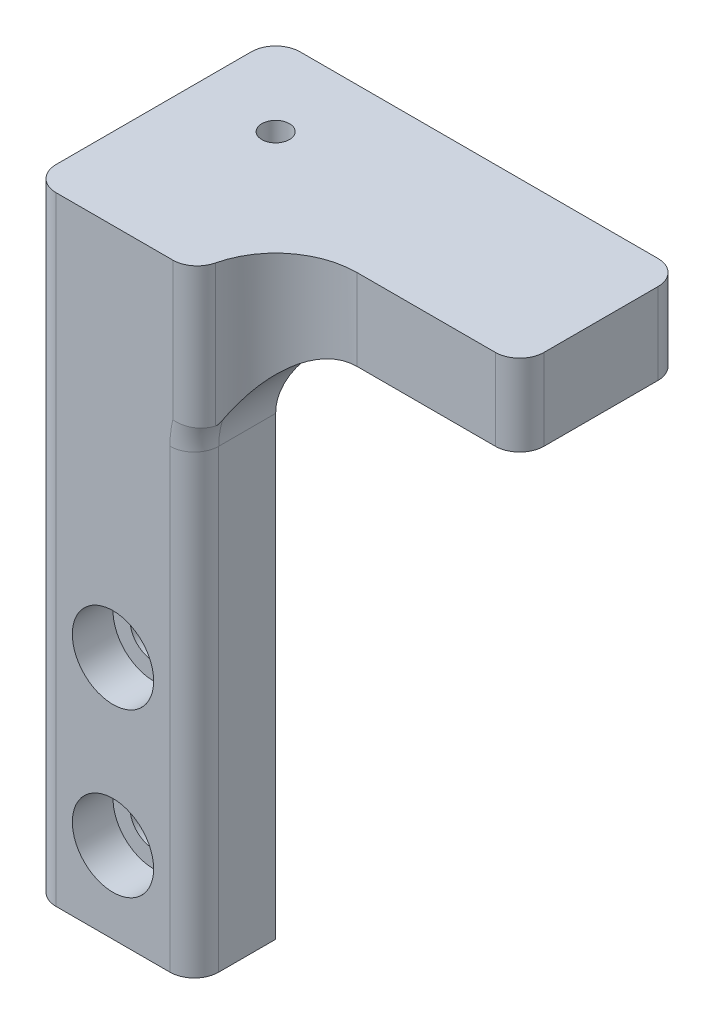
ISO-10303-21;
HEADER;
FILE_DESCRIPTION(('STEP AP214'),'2;1');
FILE_NAME('part.step','',(''),(''),'','','');
FILE_SCHEMA(('AUTOMOTIVE_DESIGN { 1 0 10303 214 1 1 1 1 }'));
ENDSEC;
DATA;
#1=APPLICATION_CONTEXT('core data for automotive mechanical design processes');
#2=APPLICATION_PROTOCOL_DEFINITION('international standard','automotive_design',2000,#1);
#3=PRODUCT_CONTEXT('',#1,'mechanical');
#4=PRODUCT('Part','Part','',(#3));
#5=PRODUCT_RELATED_PRODUCT_CATEGORY('part','',(#4));
#6=PRODUCT_DEFINITION_FORMATION('','',#4);
#7=PRODUCT_DEFINITION_CONTEXT('part definition',#1,'design');
#8=PRODUCT_DEFINITION('design','',#6,#7);
#9=PRODUCT_DEFINITION_SHAPE('','',#8);
#10=(LENGTH_UNIT() NAMED_UNIT(*) SI_UNIT(.MILLI.,.METRE.));
#11=(NAMED_UNIT(*) PLANE_ANGLE_UNIT() SI_UNIT($,.RADIAN.));
#12=(NAMED_UNIT(*) SI_UNIT($,.STERADIAN.) SOLID_ANGLE_UNIT());
#13=UNCERTAINTY_MEASURE_WITH_UNIT(LENGTH_MEASURE(1.E-05),#10,'distance_accuracy_value','');
#14=(GEOMETRIC_REPRESENTATION_CONTEXT(3) GLOBAL_UNCERTAINTY_ASSIGNED_CONTEXT((#13)) GLOBAL_UNIT_ASSIGNED_CONTEXT((#10,
#11,#12)) REPRESENTATION_CONTEXT('',''));
#15=CARTESIAN_POINT('',(0.,0.,0.));
#16=DIRECTION('',(0.,0.,1.));
#17=DIRECTION('',(1.,0.,0.));
#18=AXIS2_PLACEMENT_3D('',#15,#16,#17);
#19=CARTESIAN_POINT('',(10.,-38.,10.));
#20=DIRECTION('',(-1.,0.,0.));
#21=DIRECTION('',(0.,0.,1.));
#22=AXIS2_PLACEMENT_3D('',#19,#20,#21);
#23=PLANE('',#22);
#24=DIRECTION('',(0.,0.,1.));
#25=VECTOR('',#24,1.);
#26=CARTESIAN_POINT('',(10.,18.,10.));
#27=LINE('',#26,#25);
#28=CARTESIAN_POINT('',(10.,18.,0.));
#29=VERTEX_POINT('',#28);
#30=CARTESIAN_POINT('',(10.,18.,7.));
#31=VERTEX_POINT('',#30);
#32=EDGE_CURVE('E238',#29,#31,#27,.T.);
#33=ORIENTED_EDGE('',*,*,#32,.T.);
#34=DIRECTION('',(0.,1.,0.));
#35=VECTOR('',#34,1.);
#36=CARTESIAN_POINT('',(10.,-38.,7.));
#37=LINE('',#36,#35);
#38=CARTESIAN_POINT('',(10.,-38.,7.));
#39=VERTEX_POINT('',#38);
#40=EDGE_CURVE('E397',#31,#39,#37,.F.);
#41=ORIENTED_EDGE('',*,*,#40,.T.);
#42=DIRECTION('',(0.,0.,-1.));
#43=VECTOR('',#42,1.);
#44=CARTESIAN_POINT('',(10.,-38.,10.));
#45=LINE('',#44,#43);
#46=CARTESIAN_POINT('',(10.,-38.,0.));
#47=VERTEX_POINT('',#46);
#48=EDGE_CURVE('E195',#39,#47,#45,.T.);
#49=ORIENTED_EDGE('',*,*,#48,.T.);
#50=DIRECTION('',(0.,1.,0.));
#51=VECTOR('',#50,1.);
#52=CARTESIAN_POINT('',(10.,-38.,0.));
#53=LINE('',#52,#51);
#54=EDGE_CURVE('E204',#47,#29,#53,.T.);
#55=ORIENTED_EDGE('',*,*,#54,.T.);
#56=EDGE_LOOP('',(#33,#41,#49,#55));
#57=FACE_BOUND('',#56,.T.);
#58=ADVANCED_FACE('F47',(#57),#23,.F.);
#59=CARTESIAN_POINT('',(-10.,38.,10.));
#60=DIRECTION('',(0.,-1.,0.));
#61=DIRECTION('',(0.,0.,-1.));
#62=AXIS2_PLACEMENT_3D('',#59,#60,#61);
#63=PLANE('',#62);
#64=CARTESIAN_POINT('',(0.,38.,-10.));
#65=DIRECTION('',(0.,-1.,0.));
#66=DIRECTION('',(0.,0.,-1.));
#67=AXIS2_PLACEMENT_3D('',#64,#65,#66);
#68=CIRCLE('',#67,1.69999999999999);
#69=CARTESIAN_POINT('',(0.,38.,-11.7));
#70=VERTEX_POINT('',#69);
#71=EDGE_CURVE('E339',#70,#70,#68,.T.);
#72=ORIENTED_EDGE('',*,*,#71,.T.);
#73=EDGE_LOOP('',(#72));
#74=FACE_BOUND('',#73,.T.);
#75=DIRECTION('',(0.,0.,-1.));
#76=VECTOR('',#75,1.);
#77=CARTESIAN_POINT('',(-10.,38.,10.));
#78=LINE('',#77,#76);
#79=CARTESIAN_POINT('',(-10.,38.,7.));
#80=VERTEX_POINT('',#79);
#81=CARTESIAN_POINT('',(-10.,38.,-17.));
#82=VERTEX_POINT('',#81);
#83=EDGE_CURVE('E194',#80,#82,#78,.T.);
#84=ORIENTED_EDGE('',*,*,#83,.F.);
#85=CARTESIAN_POINT('',(-7.,38.,7.));
#86=DIRECTION('',(0.,-1.,0.));
#87=DIRECTION('',(0.,0.,-1.));
#88=AXIS2_PLACEMENT_3D('',#85,#86,#87);
#89=CIRCLE('',#88,3.);
#90=CARTESIAN_POINT('',(-7.,38.,10.));
#91=VERTEX_POINT('',#90);
#92=EDGE_CURVE('E417',#80,#91,#89,.F.);
#93=ORIENTED_EDGE('',*,*,#92,.T.);
#94=DIRECTION('',(-1.,0.,0.));
#95=VECTOR('',#94,1.);
#96=CARTESIAN_POINT('',(-10.,38.,10.));
#97=LINE('',#96,#95);
#98=CARTESIAN_POINT('',(7.35088935932648,38.,10.));
#99=VERTEX_POINT('',#98);
#100=EDGE_CURVE('E209',#99,#91,#97,.T.);
#101=ORIENTED_EDGE('',*,*,#100,.F.);
#102=CARTESIAN_POINT('',(7.35088935932648,38.,7.));
#103=DIRECTION('',(0.,-1.,0.));
#104=DIRECTION('',(0.,0.,-1.));
#105=AXIS2_PLACEMENT_3D('',#102,#103,#104);
#106=CIRCLE('',#105,3.);
#107=CARTESIAN_POINT('',(10.2699148917896,38.,7.69230769230769));
#108=VERTEX_POINT('',#107);
#109=EDGE_CURVE('E414',#99,#108,#106,.F.);
#110=ORIENTED_EDGE('',*,*,#109,.T.);
#111=CARTESIAN_POINT('',(20.,38.,10.));
#112=DIRECTION('',(0.,-1.,0.));
#113=DIRECTION('',(0.,0.,-1.));
#114=AXIS2_PLACEMENT_3D('',#111,#112,#113);
#115=CIRCLE('',#114,10.);
#116=CARTESIAN_POINT('',(20.,38.,0.));
#117=VERTEX_POINT('',#116);
#118=EDGE_CURVE('E235',#108,#117,#115,.T.);
#119=ORIENTED_EDGE('',*,*,#118,.T.);
#120=DIRECTION('',(-1.,0.,0.));
#121=VECTOR('',#120,1.);
#122=CARTESIAN_POINT('',(40.,38.,0.));
#123=LINE('',#122,#121);
#124=CARTESIAN_POINT('',(37.,38.,0.));
#125=VERTEX_POINT('',#124);
#126=EDGE_CURVE('E688',#125,#117,#123,.T.);
#127=ORIENTED_EDGE('',*,*,#126,.F.);
#128=CARTESIAN_POINT('',(37.,38.,-3.));
#129=DIRECTION('',(0.,-1.,0.));
#130=DIRECTION('',(0.,0.,-1.));
#131=AXIS2_PLACEMENT_3D('',#128,#129,#130);
#132=CIRCLE('',#131,3.);
#133=CARTESIAN_POINT('',(40.,38.,-3.));
#134=VERTEX_POINT('',#133);
#135=EDGE_CURVE('E410',#125,#134,#132,.F.);
#136=ORIENTED_EDGE('',*,*,#135,.T.);
#137=DIRECTION('',(0.,0.,1.));
#138=VECTOR('',#137,1.);
#139=CARTESIAN_POINT('',(40.,38.,-20.));
#140=LINE('',#139,#138);
#141=CARTESIAN_POINT('',(40.,38.,-17.));
#142=VERTEX_POINT('',#141);
#143=EDGE_CURVE('E365',#142,#134,#140,.T.);
#144=ORIENTED_EDGE('',*,*,#143,.F.);
#145=CARTESIAN_POINT('',(37.,38.,-17.));
#146=DIRECTION('',(0.,-1.,0.));
#147=DIRECTION('',(0.,0.,-1.));
#148=AXIS2_PLACEMENT_3D('',#145,#146,#147);
#149=CIRCLE('',#148,3.);
#150=CARTESIAN_POINT('',(37.,38.,-20.));
#151=VERTEX_POINT('',#150);
#152=EDGE_CURVE('E412',#142,#151,#149,.F.);
#153=ORIENTED_EDGE('',*,*,#152,.T.);
#154=DIRECTION('',(1.,0.,0.));
#155=VECTOR('',#154,1.);
#156=CARTESIAN_POINT('',(-41.6227766016838,38.,-20.));
#157=LINE('',#156,#155);
#158=CARTESIAN_POINT('',(-7.,38.,-20.));
#159=VERTEX_POINT('',#158);
#160=EDGE_CURVE('E338',#159,#151,#157,.T.);
#161=ORIENTED_EDGE('',*,*,#160,.F.);
#162=CARTESIAN_POINT('',(-7.,38.,-17.));
#163=DIRECTION('',(0.,-1.,0.));
#164=DIRECTION('',(0.,0.,-1.));
#165=AXIS2_PLACEMENT_3D('',#162,#163,#164);
#166=CIRCLE('',#165,3.);
#167=EDGE_CURVE('E347',#159,#82,#166,.F.);
#168=ORIENTED_EDGE('',*,*,#167,.T.);
#169=EDGE_LOOP('',(#84,#93,#101,#110,#119,#127,#136,#144,#153,#161,#168));
#170=FACE_BOUND('',#169,.T.);
#171=ADVANCED_FACE('F306',(#74,#170),#63,.F.);
#172=CARTESIAN_POINT('',(-10.,-38.,10.));
#173=DIRECTION('',(1.,0.,0.));
#174=DIRECTION('',(0.,0.,-1.));
#175=AXIS2_PLACEMENT_3D('',#172,#173,#174);
#176=PLANE('',#175);
#177=DIRECTION('',(0.,0.,-1.));
#178=VECTOR('',#177,1.);
#179=CARTESIAN_POINT('',(-10.,-38.,10.));
#180=LINE('',#179,#178);
#181=CARTESIAN_POINT('',(-10.,-38.,7.));
#182=VERTEX_POINT('',#181);
#183=CARTESIAN_POINT('',(-10.,-38.,0.));
#184=VERTEX_POINT('',#183);
#185=EDGE_CURVE('E183',#182,#184,#180,.T.);
#186=ORIENTED_EDGE('',*,*,#185,.F.);
#187=DIRECTION('',(0.,-1.,0.));
#188=VECTOR('',#187,1.);
#189=CARTESIAN_POINT('',(-10.,-38.,7.));
#190=LINE('',#189,#188);
#191=EDGE_CURVE('E408',#182,#80,#190,.F.);
#192=ORIENTED_EDGE('',*,*,#191,.T.);
#193=ORIENTED_EDGE('',*,*,#83,.T.);
#194=DIRECTION('',(0.,-1.,0.));
#195=VECTOR('',#194,1.);
#196=CARTESIAN_POINT('',(-10.,28.,-17.));
#197=LINE('',#196,#195);
#198=CARTESIAN_POINT('',(-10.,28.,-17.));
#199=VERTEX_POINT('',#198);
#200=EDGE_CURVE('E406',#82,#199,#197,.T.);
#201=ORIENTED_EDGE('',*,*,#200,.T.);
#202=DIRECTION('',(0.,0.,1.));
#203=VECTOR('',#202,1.);
#204=CARTESIAN_POINT('',(-10.,28.,10.));
#205=LINE('',#204,#203);
#206=CARTESIAN_POINT('',(-10.,28.,-10.));
#207=VERTEX_POINT('',#206);
#208=EDGE_CURVE('E421',#199,#207,#205,.T.);
#209=ORIENTED_EDGE('',*,*,#208,.T.);
#210=CARTESIAN_POINT('',(-10.,18.,-10.));
#211=DIRECTION('',(1.,0.,0.));
#212=DIRECTION('',(0.,0.,-1.));
#213=AXIS2_PLACEMENT_3D('',#210,#211,#212);
#214=CIRCLE('',#213,10.);
#215=CARTESIAN_POINT('',(-10.,18.,0.));
#216=VERTEX_POINT('',#215);
#217=EDGE_CURVE('E201',#207,#216,#214,.T.);
#218=ORIENTED_EDGE('',*,*,#217,.T.);
#219=DIRECTION('',(0.,-1.,0.));
#220=VECTOR('',#219,1.);
#221=CARTESIAN_POINT('',(-10.,-38.,0.));
#222=LINE('',#221,#220);
#223=EDGE_CURVE('E198',#216,#184,#222,.T.);
#224=ORIENTED_EDGE('',*,*,#223,.T.);
#225=EDGE_LOOP('',(#186,#192,#193,#201,#209,#218,#224));
#226=FACE_BOUND('',#225,.T.);
#227=ADVANCED_FACE('F199',(#226),#176,.F.);
#228=CARTESIAN_POINT('',(-10.,-38.,10.));
#229=DIRECTION('',(0.,1.,0.));
#230=DIRECTION('',(0.,0.,1.));
#231=AXIS2_PLACEMENT_3D('',#228,#229,#230);
#232=PLANE('',#231);
#233=ORIENTED_EDGE('',*,*,#48,.F.);
#234=CARTESIAN_POINT('',(7.,-38.,7.));
#235=DIRECTION('',(0.,1.,0.));
#236=DIRECTION('',(0.,0.,1.));
#237=AXIS2_PLACEMENT_3D('',#234,#235,#236);
#238=CIRCLE('',#237,3.);
#239=CARTESIAN_POINT('',(7.,-38.,10.));
#240=VERTEX_POINT('',#239);
#241=EDGE_CURVE('E401',#39,#240,#238,.F.);
#242=ORIENTED_EDGE('',*,*,#241,.T.);
#243=DIRECTION('',(1.,0.,0.));
#244=VECTOR('',#243,1.);
#245=CARTESIAN_POINT('',(-10.,-38.,10.));
#246=LINE('',#245,#244);
#247=CARTESIAN_POINT('',(-7.,-38.,10.));
#248=VERTEX_POINT('',#247);
#249=EDGE_CURVE('E213',#248,#240,#246,.T.);
#250=ORIENTED_EDGE('',*,*,#249,.F.);
#251=CARTESIAN_POINT('',(-7.,-38.,7.));
#252=DIRECTION('',(0.,1.,0.));
#253=DIRECTION('',(0.,0.,1.));
#254=AXIS2_PLACEMENT_3D('',#251,#252,#253);
#255=CIRCLE('',#254,3.);
#256=EDGE_CURVE('E191',#248,#182,#255,.F.);
#257=ORIENTED_EDGE('',*,*,#256,.T.);
#258=ORIENTED_EDGE('',*,*,#185,.T.);
#259=DIRECTION('',(1.,0.,0.));
#260=VECTOR('',#259,1.);
#261=CARTESIAN_POINT('',(-10.,-38.,0.));
#262=LINE('',#261,#260);
#263=EDGE_CURVE('E188',#184,#47,#262,.T.);
#264=ORIENTED_EDGE('',*,*,#263,.T.);
#265=EDGE_LOOP('',(#233,#242,#250,#257,#258,#264));
#266=FACE_BOUND('',#265,.T.);
#267=ADVANCED_FACE('F186',(#266),#232,.F.);
#268=CARTESIAN_POINT('',(0.,0.,10.));
#269=DIRECTION('',(0.,0.,-1.));
#270=DIRECTION('',(-1.,0.,0.));
#271=AXIS2_PLACEMENT_3D('',#268,#269,#270);
#272=PLANE('',#271);
#273=CARTESIAN_POINT('',(0.,-8.,10.));
#274=DIRECTION('',(0.,0.,1.));
#275=DIRECTION('',(1.,0.,0.));
#276=AXIS2_PLACEMENT_3D('',#273,#274,#275);
#277=CIRCLE('',#276,5.);
#278=CARTESIAN_POINT('',(5.,-8.,10.));
#279=VERTEX_POINT('',#278);
#280=EDGE_CURVE('E684',#279,#279,#277,.T.);
#281=ORIENTED_EDGE('',*,*,#280,.F.);
#282=EDGE_LOOP('',(#281));
#283=FACE_BOUND('',#282,.T.);
#284=CARTESIAN_POINT('',(0.,-28.,10.));
#285=DIRECTION('',(0.,0.,1.));
#286=DIRECTION('',(1.,0.,0.));
#287=AXIS2_PLACEMENT_3D('',#284,#285,#286);
#288=CIRCLE('',#287,5.);
#289=CARTESIAN_POINT('',(5.,-28.,10.));
#290=VERTEX_POINT('',#289);
#291=EDGE_CURVE('E231',#290,#290,#288,.T.);
#292=ORIENTED_EDGE('',*,*,#291,.F.);
#293=EDGE_LOOP('',(#292));
#294=FACE_BOUND('',#293,.T.);
#295=ORIENTED_EDGE('',*,*,#100,.T.);
#296=DIRECTION('',(0.,-1.,0.));
#297=VECTOR('',#296,1.);
#298=CARTESIAN_POINT('',(-7.,0.,10.));
#299=LINE('',#298,#297);
#300=EDGE_CURVE('E381',#91,#248,#299,.T.);
#301=ORIENTED_EDGE('',*,*,#300,.T.);
#302=ORIENTED_EDGE('',*,*,#249,.T.);
#303=DIRECTION('',(0.,1.,0.));
#304=VECTOR('',#303,1.);
#305=CARTESIAN_POINT('',(7.,0.,10.));
#306=LINE('',#305,#304);
#307=CARTESIAN_POINT('',(6.99999999999999,18.,10.));
#308=VERTEX_POINT('',#307);
#309=EDGE_CURVE('E378',#240,#308,#306,.T.);
#310=ORIENTED_EDGE('',*,*,#309,.T.);
#311=CARTESIAN_POINT('',(20.,18.,10.));
#312=DIRECTION('',(0.,0.,-1.));
#313=DIRECTION('',(-1.,0.,0.));
#314=AXIS2_PLACEMENT_3D('',#311,#312,#313);
#315=CIRCLE('',#314,13.);
#316=CARTESIAN_POINT('',(7.35088935932648,21.,10.));
#317=VERTEX_POINT('',#316);
#318=EDGE_CURVE('E376',#308,#317,#315,.T.);
#319=ORIENTED_EDGE('',*,*,#318,.T.);
#320=DIRECTION('',(0.,1.,0.));
#321=VECTOR('',#320,1.);
#322=CARTESIAN_POINT('',(7.35088935932648,0.,10.));
#323=LINE('',#322,#321);
#324=EDGE_CURVE('E374',#317,#99,#323,.T.);
#325=ORIENTED_EDGE('',*,*,#324,.T.);
#326=EDGE_LOOP('',(#295,#301,#302,#310,#319,#325));
#327=FACE_BOUND('',#326,.T.);
#328=ADVANCED_FACE('F315',(#283,#294,#327),#272,.F.);
#329=CARTESIAN_POINT('',(0.,0.,0.));
#330=DIRECTION('',(0.,0.,-1.));
#331=DIRECTION('',(-1.,0.,0.));
#332=AXIS2_PLACEMENT_3D('',#329,#330,#331);
#333=PLANE('',#332);
#334=CARTESIAN_POINT('',(0.,-8.,0.));
#335=DIRECTION('',(0.,0.,-1.));
#336=DIRECTION('',(-1.,0.,0.));
#337=AXIS2_PLACEMENT_3D('',#334,#335,#336);
#338=CIRCLE('',#337,2.9);
#339=CARTESIAN_POINT('',(-2.9,-8.,0.));
#340=VERTEX_POINT('',#339);
#341=EDGE_CURVE('E227',#340,#340,#338,.T.);
#342=ORIENTED_EDGE('',*,*,#341,.F.);
#343=EDGE_LOOP('',(#342));
#344=FACE_BOUND('',#343,.T.);
#345=CARTESIAN_POINT('',(0.,-28.,0.));
#346=DIRECTION('',(0.,0.,-1.));
#347=DIRECTION('',(-1.,0.,0.));
#348=AXIS2_PLACEMENT_3D('',#345,#346,#347);
#349=CIRCLE('',#348,2.9);
#350=CARTESIAN_POINT('',(-2.9,-28.,0.));
#351=VERTEX_POINT('',#350);
#352=EDGE_CURVE('E221',#351,#351,#349,.T.);
#353=ORIENTED_EDGE('',*,*,#352,.F.);
#354=EDGE_LOOP('',(#353));
#355=FACE_BOUND('',#354,.T.);
#356=ORIENTED_EDGE('',*,*,#223,.F.);
#357=DIRECTION('',(-1.,0.,0.));
#358=VECTOR('',#357,1.);
#359=CARTESIAN_POINT('',(9.99999999999999,18.,0.));
#360=LINE('',#359,#358);
#361=EDGE_CURVE('E248',#216,#29,#360,.F.);
#362=ORIENTED_EDGE('',*,*,#361,.T.);
#363=ORIENTED_EDGE('',*,*,#54,.F.);
#364=ORIENTED_EDGE('',*,*,#263,.F.);
#365=EDGE_LOOP('',(#356,#362,#363,#364));
#366=FACE_BOUND('',#365,.T.);
#367=ADVANCED_FACE('F206',(#344,#355,#366),#333,.T.);
#368=CARTESIAN_POINT('',(-41.6227766016838,38.,-20.));
#369=DIRECTION('',(0.,0.,-1.));
#370=DIRECTION('',(-1.,0.,0.));
#371=AXIS2_PLACEMENT_3D('',#368,#369,#370);
#372=PLANE('',#371);
#373=DIRECTION('',(1.,0.,0.));
#374=VECTOR('',#373,1.);
#375=CARTESIAN_POINT('',(-41.6227766016838,28.,-20.));
#376=LINE('',#375,#374);
#377=CARTESIAN_POINT('',(-7.,28.,-20.));
#378=VERTEX_POINT('',#377);
#379=CARTESIAN_POINT('',(37.,28.,-20.));
#380=VERTEX_POINT('',#379);
#381=EDGE_CURVE('E331',#378,#380,#376,.T.);
#382=ORIENTED_EDGE('',*,*,#381,.F.);
#383=DIRECTION('',(0.,-1.,0.));
#384=VECTOR('',#383,1.);
#385=CARTESIAN_POINT('',(-7.,38.,-20.));
#386=LINE('',#385,#384);
#387=EDGE_CURVE('E334',#378,#159,#386,.F.);
#388=ORIENTED_EDGE('',*,*,#387,.T.);
#389=ORIENTED_EDGE('',*,*,#160,.T.);
#390=DIRECTION('',(0.,1.,0.));
#391=VECTOR('',#390,1.);
#392=CARTESIAN_POINT('',(37.,28.,-20.));
#393=LINE('',#392,#391);
#394=EDGE_CURVE('E337',#151,#380,#393,.F.);
#395=ORIENTED_EDGE('',*,*,#394,.T.);
#396=EDGE_LOOP('',(#382,#388,#389,#395));
#397=FACE_BOUND('',#396,.T.);
#398=ADVANCED_FACE('F318',(#397),#372,.T.);
#399=CARTESIAN_POINT('',(-41.6227766016838,28.,10.));
#400=DIRECTION('',(0.,-1.,0.));
#401=DIRECTION('',(0.,0.,-1.));
#402=AXIS2_PLACEMENT_3D('',#399,#400,#401);
#403=PLANE('',#402);
#404=ORIENTED_EDGE('',*,*,#208,.F.);
#405=CARTESIAN_POINT('',(-7.,28.,-17.));
#406=DIRECTION('',(0.,-1.,0.));
#407=DIRECTION('',(0.,0.,-1.));
#408=AXIS2_PLACEMENT_3D('',#405,#406,#407);
#409=CIRCLE('',#408,3.);
#410=EDGE_CURVE('E345',#199,#378,#409,.T.);
#411=ORIENTED_EDGE('',*,*,#410,.T.);
#412=ORIENTED_EDGE('',*,*,#381,.T.);
#413=CARTESIAN_POINT('',(37.,28.,-17.));
#414=DIRECTION('',(0.,-1.,0.));
#415=DIRECTION('',(0.,0.,-1.));
#416=AXIS2_PLACEMENT_3D('',#413,#414,#415);
#417=CIRCLE('',#416,3.);
#418=CARTESIAN_POINT('',(40.,28.,-17.));
#419=VERTEX_POINT('',#418);
#420=EDGE_CURVE('E70',#380,#419,#417,.T.);
#421=ORIENTED_EDGE('',*,*,#420,.T.);
#422=DIRECTION('',(0.,0.,-1.));
#423=VECTOR('',#422,1.);
#424=CARTESIAN_POINT('',(40.,28.,-20.));
#425=LINE('',#424,#423);
#426=CARTESIAN_POINT('',(40.,28.,-3.));
#427=VERTEX_POINT('',#426);
#428=EDGE_CURVE('E371',#427,#419,#425,.T.);
#429=ORIENTED_EDGE('',*,*,#428,.F.);
#430=CARTESIAN_POINT('',(37.,28.,-3.));
#431=DIRECTION('',(0.,-1.,0.));
#432=DIRECTION('',(0.,0.,-1.));
#433=AXIS2_PLACEMENT_3D('',#430,#431,#432);
#434=CIRCLE('',#433,3.);
#435=CARTESIAN_POINT('',(37.,28.,0.));
#436=VERTEX_POINT('',#435);
#437=EDGE_CURVE('E78',#427,#436,#434,.T.);
#438=ORIENTED_EDGE('',*,*,#437,.T.);
#439=DIRECTION('',(-1.,0.,0.));
#440=VECTOR('',#439,1.);
#441=CARTESIAN_POINT('',(40.,28.,0.));
#442=LINE('',#441,#440);
#443=CARTESIAN_POINT('',(20.,28.,0.));
#444=VERTEX_POINT('',#443);
#445=EDGE_CURVE('E690',#436,#444,#442,.T.);
#446=ORIENTED_EDGE('',*,*,#445,.T.);
#447=DIRECTION('',(0.,0.,1.));
#448=VECTOR('',#447,1.);
#449=CARTESIAN_POINT('',(20.,28.,10.));
#450=LINE('',#449,#448);
#451=CARTESIAN_POINT('',(20.,28.,-10.));
#452=VERTEX_POINT('',#451);
#453=EDGE_CURVE('E246',#444,#452,#450,.F.);
#454=ORIENTED_EDGE('',*,*,#453,.T.);
#455=DIRECTION('',(-1.,0.,0.));
#456=VECTOR('',#455,1.);
#457=CARTESIAN_POINT('',(-10.,28.,-10.));
#458=LINE('',#457,#456);
#459=CARTESIAN_POINT('',(1.69999999999999,28.,-10.));
#460=VERTEX_POINT('',#459);
#461=EDGE_CURVE('E244',#452,#460,#458,.T.);
#462=ORIENTED_EDGE('',*,*,#461,.T.);
#463=CARTESIAN_POINT('',(0.,28.,-10.));
#464=DIRECTION('',(0.,-1.,0.));
#465=DIRECTION('',(0.,0.,-1.));
#466=AXIS2_PLACEMENT_3D('',#463,#464,#465);
#467=CIRCLE('',#466,1.69999999999999);
#468=CARTESIAN_POINT('',(-1.69999999999999,28.,-10.));
#469=VERTEX_POINT('',#468);
#470=EDGE_CURVE('E225',#469,#460,#467,.T.);
#471=ORIENTED_EDGE('',*,*,#470,.F.);
#472=DIRECTION('',(-1.,0.,0.));
#473=VECTOR('',#472,1.);
#474=CARTESIAN_POINT('',(-10.,28.,-10.));
#475=LINE('',#474,#473);
#476=EDGE_CURVE('E241',#469,#207,#475,.T.);
#477=ORIENTED_EDGE('',*,*,#476,.T.);
#478=EDGE_LOOP('',(#404,#411,#412,#421,#429,#438,#446,#454,#462,#471,#477));
#479=FACE_BOUND('',#478,.T.);
#480=ADVANCED_FACE('F323',(#479),#403,.T.);
#481=CARTESIAN_POINT('',(0.,28.,-10.));
#482=DIRECTION('',(0.,-1.,0.));
#483=DIRECTION('',(0.,0.,-1.));
#484=AXIS2_PLACEMENT_3D('',#481,#482,#483);
#485=CYLINDRICAL_SURFACE('',#484,1.69999999999999);
#486=ORIENTED_EDGE('',*,*,#71,.F.);
#487=EDGE_LOOP('',(#486));
#488=FACE_BOUND('',#487,.T.);
#489=ORIENTED_EDGE('',*,*,#470,.T.);
#490=CARTESIAN_POINT('',(1.69999999999999,28.,-10.));
#491=CARTESIAN_POINT('',(1.70000008065867,28.0000018760986,-9.95253556047457));
#492=CARTESIAN_POINT('',(1.69801091334796,27.9996616463715,-9.90509418536369));
#493=CARTESIAN_POINT('',(1.69007793011952,27.9983169017896,-9.81055745719454));
#494=CARTESIAN_POINT('',(1.68413450777537,27.9973124530458,-9.76346207017112));
#495=CARTESIAN_POINT('',(1.66044231100782,27.9933383087929,-9.62333322302317));
#496=CARTESIAN_POINT('',(1.63683136526351,27.9894076449062,-9.53124877763525));
#497=CARTESIAN_POINT('',(1.57468110992774,27.979413361435,-9.35242348007787));
#498=CARTESIAN_POINT('',(1.53613848869576,27.9733492687128,-9.26568381825782));
#499=CARTESIAN_POINT('',(1.44524420132408,27.95975492472,-9.09988745715361));
#500=CARTESIAN_POINT('',(1.39289234645434,27.9522246534117,-9.02083086289374));
#501=CARTESIAN_POINT('',(1.27532258811616,27.9364497832573,-8.87188895116316));
#502=CARTESIAN_POINT('',(1.20999577063888,27.9281994938029,-8.80209023931832));
#503=CARTESIAN_POINT('',(1.06855695943284,27.9119568197651,-8.67438099000878));
#504=CARTESIAN_POINT('',(0.99244325120737,27.9039644764289,-8.61647234597257));
#505=CARTESIAN_POINT('',(0.83099296287365,27.8890878275267,-8.51384461702634));
#506=CARTESIAN_POINT('',(0.745600463085492,27.8822109423708,-8.46921233567101));
#507=CARTESIAN_POINT('',(0.568398639615348,27.8704241643023,-8.39496140023235));
#508=CARTESIAN_POINT('',(0.476590135011764,27.8655140208489,-8.3653408336968));
#509=CARTESIAN_POINT('',(0.290086790443934,27.8582734606039,-8.32222692751739));
#510=CARTESIAN_POINT('',(0.195427880247859,27.8559188594726,-8.30858230082173));
#511=CARTESIAN_POINT('',(0.00513485345516602,27.8539828509648,-8.29733835567878));
#512=CARTESIAN_POINT('',(-0.0904992142725625,27.8544013052951,-8.29973823708707));
#513=CARTESIAN_POINT('',(-0.278940417479717,27.8579421556927,-8.32039262660098));
#514=CARTESIAN_POINT('',(-0.37176689033332,27.8610354375616,-8.33847642912052));
#515=CARTESIAN_POINT('',(-0.55304817626267,27.8695317849078,-8.38971717491809));
#516=CARTESIAN_POINT('',(-0.641502862017202,27.8749349176117,-8.42287455690325));
#517=CARTESIAN_POINT('',(-0.812041035314987,27.8874735790632,-8.5034939805181));
#518=CARTESIAN_POINT('',(-0.894090382022086,27.8946176517067,-8.55102685799415));
#519=CARTESIAN_POINT('',(-1.04911005995209,27.9098270001098,-8.65899607356616));
#520=CARTESIAN_POINT('',(-1.12207996298593,27.9178923192813,-8.71943301985677));
#521=CARTESIAN_POINT('',(-1.2578518305698,27.9341623443613,-8.85241416099238));
#522=CARTESIAN_POINT('',(-1.32051190269432,27.9423675141806,-8.92510324008179));
#523=CARTESIAN_POINT('',(-1.43278496609109,27.9578999122054,-9.08006434803198));
#524=CARTESIAN_POINT('',(-1.48239428884817,27.965226893241,-9.16233906202021));
#525=CARTESIAN_POINT('',(-1.56717199199374,27.9781894259011,-9.33428289649962));
#526=CARTESIAN_POINT('',(-1.60231913773518,27.9838224871215,-9.42396265957925));
#527=CARTESIAN_POINT('',(-1.65696301182067,27.992736780635,-9.60800844545981));
#528=CARTESIAN_POINT('',(-1.67648303316691,27.9960215124445,-9.70236727009374));
#529=CARTESIAN_POINT('',(-1.69193997380406,27.9986325572336,-9.83120573700485));
#530=CARTESIAN_POINT('',(-1.69496373741791,27.9991449199564,-9.86492159641112));
#531=CARTESIAN_POINT('',(-1.69899112421807,27.9998282938431,-9.93242004223614));
#532=CARTESIAN_POINT('',(-1.69999815379408,27.9999998805948,-9.9662024195015));
#533=CARTESIAN_POINT('',(-1.69999999999999,28.,-10.));
#534=B_SPLINE_CURVE_WITH_KNOTS('',3,(#490,#491,#492,#493,#494,#495,#496,#497,#498,#499,#500,
#501,#502,#503,#504,#505,#506,#507,#508,#509,#510,#511,#512,#513,#514,#515,#516,#517,#518,#519,
#520,#521,#522,#523,#524,#525,#526,#527,#528,#529,#530,#531,#532,#533),.UNSPECIFIED.,.F.,.F.,(4,
2,2,2,2,2,2,2,2,2,2,2,2,2,2,2,2,2,2,2,2,4),(0.,0.1423048095408,0.284595457365763,
0.568559897021974,0.852587352178389,1.1366186893237,1.42314348455295,1.7097138719667,
1.99811868915101,2.28648675509327,2.57210139698584,2.85770179529697,3.14023215069378,
3.42277072948669,3.70672486205057,3.99069238089834,4.27828966809313,4.56596771159922,
4.85406665502619,5.14173536899451,5.24325394666756,5.34460090801449),.UNSPECIFIED.);
#535=EDGE_CURVE('E253',#460,#469,#534,.T.);
#536=ORIENTED_EDGE('',*,*,#535,.T.);
#537=EDGE_LOOP('',(#489,#536));
#538=FACE_BOUND('',#537,.T.);
#539=ADVANCED_FACE('F262',(#488,#538),#485,.F.);
#540=CARTESIAN_POINT('',(0.,-28.,10.));
#541=DIRECTION('',(0.,0.,1.));
#542=DIRECTION('',(1.,0.,0.));
#543=AXIS2_PLACEMENT_3D('',#540,#541,#542);
#544=CYLINDRICAL_SURFACE('',#543,2.9);
#545=ORIENTED_EDGE('',*,*,#352,.T.);
#546=EDGE_LOOP('',(#545));
#547=FACE_BOUND('',#546,.T.);
#548=CARTESIAN_POINT('',(0.,-28.,5.));
#549=DIRECTION('',(0.,0.,1.));
#550=DIRECTION('',(1.,0.,0.));
#551=AXIS2_PLACEMENT_3D('',#548,#549,#550);
#552=CIRCLE('',#551,2.9);
#553=CARTESIAN_POINT('',(2.9,-28.,5.));
#554=VERTEX_POINT('',#553);
#555=EDGE_CURVE('E226',#554,#554,#552,.T.);
#556=ORIENTED_EDGE('',*,*,#555,.T.);
#557=EDGE_LOOP('',(#556));
#558=FACE_BOUND('',#557,.T.);
#559=ADVANCED_FACE('F577',(#547,#558),#544,.F.);
#560=CARTESIAN_POINT('',(2.9,-28.,5.));
#561=DIRECTION('',(0.,0.,-1.));
#562=DIRECTION('',(-1.,0.,0.));
#563=AXIS2_PLACEMENT_3D('',#560,#561,#562);
#564=PLANE('',#563);
#565=ORIENTED_EDGE('',*,*,#555,.F.);
#566=EDGE_LOOP('',(#565));
#567=FACE_BOUND('',#566,.T.);
#568=CARTESIAN_POINT('',(0.,-28.,5.));
#569=DIRECTION('',(0.,0.,1.));
#570=DIRECTION('',(1.,0.,0.));
#571=AXIS2_PLACEMENT_3D('',#568,#569,#570);
#572=CIRCLE('',#571,5.);
#573=CARTESIAN_POINT('',(5.,-28.,5.));
#574=VERTEX_POINT('',#573);
#575=EDGE_CURVE('E670',#574,#574,#572,.T.);
#576=ORIENTED_EDGE('',*,*,#575,.T.);
#577=EDGE_LOOP('',(#576));
#578=FACE_BOUND('',#577,.T.);
#579=ADVANCED_FACE('F567',(#567,#578),#564,.F.);
#580=CARTESIAN_POINT('',(0.,-28.,10.));
#581=DIRECTION('',(0.,0.,1.));
#582=DIRECTION('',(1.,0.,0.));
#583=AXIS2_PLACEMENT_3D('',#580,#581,#582);
#584=CYLINDRICAL_SURFACE('',#583,5.);
#585=ORIENTED_EDGE('',*,*,#575,.F.);
#586=EDGE_LOOP('',(#585));
#587=FACE_BOUND('',#586,.T.);
#588=ORIENTED_EDGE('',*,*,#291,.T.);
#589=EDGE_LOOP('',(#588));
#590=FACE_BOUND('',#589,.T.);
#591=ADVANCED_FACE('F558',(#587,#590),#584,.F.);
#592=CARTESIAN_POINT('',(0.,-8.,10.));
#593=DIRECTION('',(0.,0.,1.));
#594=DIRECTION('',(1.,0.,0.));
#595=AXIS2_PLACEMENT_3D('',#592,#593,#594);
#596=CYLINDRICAL_SURFACE('',#595,2.9);
#597=ORIENTED_EDGE('',*,*,#341,.T.);
#598=EDGE_LOOP('',(#597));
#599=FACE_BOUND('',#598,.T.);
#600=CARTESIAN_POINT('',(0.,-8.,5.));
#601=DIRECTION('',(0.,0.,1.));
#602=DIRECTION('',(1.,0.,0.));
#603=AXIS2_PLACEMENT_3D('',#600,#601,#602);
#604=CIRCLE('',#603,2.9);
#605=CARTESIAN_POINT('',(2.9,-8.,5.));
#606=VERTEX_POINT('',#605);
#607=EDGE_CURVE('E232',#606,#606,#604,.T.);
#608=ORIENTED_EDGE('',*,*,#607,.T.);
#609=EDGE_LOOP('',(#608));
#610=FACE_BOUND('',#609,.T.);
#611=ADVANCED_FACE('F549',(#599,#610),#596,.F.);
#612=CARTESIAN_POINT('',(2.9,-8.,5.));
#613=DIRECTION('',(0.,0.,-1.));
#614=DIRECTION('',(-1.,0.,0.));
#615=AXIS2_PLACEMENT_3D('',#612,#613,#614);
#616=PLANE('',#615);
#617=ORIENTED_EDGE('',*,*,#607,.F.);
#618=EDGE_LOOP('',(#617));
#619=FACE_BOUND('',#618,.T.);
#620=CARTESIAN_POINT('',(0.,-8.,5.));
#621=DIRECTION('',(0.,0.,1.));
#622=DIRECTION('',(1.,0.,0.));
#623=AXIS2_PLACEMENT_3D('',#620,#621,#622);
#624=CIRCLE('',#623,5.);
#625=CARTESIAN_POINT('',(5.,-8.,5.));
#626=VERTEX_POINT('',#625);
#627=EDGE_CURVE('E680',#626,#626,#624,.T.);
#628=ORIENTED_EDGE('',*,*,#627,.T.);
#629=EDGE_LOOP('',(#628));
#630=FACE_BOUND('',#629,.T.);
#631=ADVANCED_FACE('F539',(#619,#630),#616,.F.);
#632=CARTESIAN_POINT('',(0.,-8.,10.));
#633=DIRECTION('',(0.,0.,1.));
#634=DIRECTION('',(1.,0.,0.));
#635=AXIS2_PLACEMENT_3D('',#632,#633,#634);
#636=CYLINDRICAL_SURFACE('',#635,5.);
#637=ORIENTED_EDGE('',*,*,#627,.F.);
#638=EDGE_LOOP('',(#637));
#639=FACE_BOUND('',#638,.T.);
#640=ORIENTED_EDGE('',*,*,#280,.T.);
#641=EDGE_LOOP('',(#640));
#642=FACE_BOUND('',#641,.T.);
#643=ADVANCED_FACE('F521',(#639,#642),#636,.F.);
#644=CARTESIAN_POINT('',(40.,38.,0.));
#645=DIRECTION('',(0.,0.,-1.));
#646=DIRECTION('',(-1.,0.,0.));
#647=AXIS2_PLACEMENT_3D('',#644,#645,#646);
#648=PLANE('',#647);
#649=ORIENTED_EDGE('',*,*,#445,.F.);
#650=DIRECTION('',(0.,-1.,0.));
#651=VECTOR('',#650,1.);
#652=CARTESIAN_POINT('',(37.,38.,0.));
#653=LINE('',#652,#651);
#654=EDGE_CURVE('E11',#436,#125,#653,.F.);
#655=ORIENTED_EDGE('',*,*,#654,.T.);
#656=ORIENTED_EDGE('',*,*,#126,.T.);
#657=DIRECTION('',(0.,-1.,0.));
#658=VECTOR('',#657,1.);
#659=CARTESIAN_POINT('',(20.,28.,0.));
#660=LINE('',#659,#658);
#661=EDGE_CURVE('E220',#117,#444,#660,.T.);
#662=ORIENTED_EDGE('',*,*,#661,.T.);
#663=EDGE_LOOP('',(#649,#655,#656,#662));
#664=FACE_BOUND('',#663,.T.);
#665=ADVANCED_FACE('F512',(#664),#648,.F.);
#666=CARTESIAN_POINT('',(40.,0.,0.));
#667=DIRECTION('',(-1.,0.,0.));
#668=DIRECTION('',(0.,0.,1.));
#669=AXIS2_PLACEMENT_3D('',#666,#667,#668);
#670=PLANE('',#669);
#671=ORIENTED_EDGE('',*,*,#428,.T.);
#672=DIRECTION('',(0.,1.,0.));
#673=VECTOR('',#672,1.);
#674=CARTESIAN_POINT('',(40.,38.,-17.));
#675=LINE('',#674,#673);
#676=EDGE_CURVE('E62',#419,#142,#675,.T.);
#677=ORIENTED_EDGE('',*,*,#676,.T.);
#678=ORIENTED_EDGE('',*,*,#143,.T.);
#679=DIRECTION('',(0.,-1.,0.));
#680=VECTOR('',#679,1.);
#681=CARTESIAN_POINT('',(40.,0.,-3.));
#682=LINE('',#681,#680);
#683=EDGE_CURVE('E348',#134,#427,#682,.T.);
#684=ORIENTED_EDGE('',*,*,#683,.T.);
#685=EDGE_LOOP('',(#671,#677,#678,#684));
#686=FACE_BOUND('',#685,.T.);
#687=ADVANCED_FACE('F302',(#686),#670,.F.);
#688=CARTESIAN_POINT('',(20.,38.,10.));
#689=DIRECTION('',(0.,1.,0.));
#690=DIRECTION('',(0.,0.,1.));
#691=AXIS2_PLACEMENT_3D('',#688,#689,#690);
#692=CYLINDRICAL_SURFACE('',#691,10.);
#693=DIRECTION('',(0.,1.,0.));
#694=VECTOR('',#693,1.);
#695=CARTESIAN_POINT('',(10.2699148917896,38.,7.69230769230769));
#696=LINE('',#695,#694);
#697=CARTESIAN_POINT('',(10.2699148917896,20.6365678451564,7.69230769230769));
#698=VERTEX_POINT('',#697);
#699=EDGE_CURVE('E296',#108,#698,#696,.F.);
#700=ORIENTED_EDGE('',*,*,#699,.T.);
#701=CARTESIAN_POINT('',(10.2699148917896,20.6365678451564,7.69230769230769));
#702=CARTESIAN_POINT('',(10.2791655657667,20.6351913803047,7.65326835961037));
#703=CARTESIAN_POINT('',(10.2886368026146,20.6381837660692,7.61441367494216));
#704=CARTESIAN_POINT('',(10.307563450995,20.6513144612778,7.5386741529402));
#705=CARTESIAN_POINT('',(10.317015892649,20.6613190898517,7.50176613807378));
#706=CARTESIAN_POINT('',(10.3395935425086,20.6920963891973,7.41556901679248));
#707=CARTESIAN_POINT('',(10.3526661621824,20.7155820550607,7.36727374764296));
#708=CARTESIAN_POINT('',(10.378520667424,20.7698512909968,7.27428996801177));
#709=CARTESIAN_POINT('',(10.3912971467114,20.8007194434932,7.22965196902674));
#710=CARTESIAN_POINT('',(10.4136215021624,20.8595463541351,7.15350255248719));
#711=CARTESIAN_POINT('',(10.4232496364105,20.8865997789526,7.12129570928584));
#712=CARTESIAN_POINT('',(10.4421428081607,20.9422424215445,7.05918588211054));
#713=CARTESIAN_POINT('',(10.4514112551328,20.9707960840647,7.02925225845529));
#714=CARTESIAN_POINT('',(10.4606079858305,21.,7.));
#715=B_SPLINE_CURVE_WITH_KNOTS('',3,(#701,#702,#703,#704,#705,#706,#707,#708,#709,#710,#711,
#712,#713,#714),.UNSPECIFIED.,.F.,.F.,(4,2,2,2,2,2,4),(0.,0.119795142329263,0.237366528129867,
0.402246129191478,0.569113824030773,0.698478153182799,0.825558123908126),.UNSPECIFIED.);
#716=CARTESIAN_POINT('',(10.4606079858305,21.,7.));
#717=VERTEX_POINT('',#716);
#718=EDGE_CURVE('E288',#698,#717,#715,.T.);
#719=ORIENTED_EDGE('',*,*,#718,.T.);
#720=CARTESIAN_POINT('',(20.,18.,10.));
#721=DIRECTION('',(0.,0.707106781186547,0.707106781186547));
#722=DIRECTION('',(0.,0.707106781186547,-0.707106781186547));
#723=AXIS2_PLACEMENT_3D('',#720,#721,#722);
#724=ELLIPSE('',#723,14.1421356237309,10.);
#725=EDGE_CURVE('E250',#717,#444,#724,.F.);
#726=ORIENTED_EDGE('',*,*,#725,.T.);
#727=ORIENTED_EDGE('',*,*,#661,.F.);
#728=ORIENTED_EDGE('',*,*,#118,.F.);
#729=EDGE_LOOP('',(#700,#719,#726,#727,#728));
#730=FACE_BOUND('',#729,.T.);
#731=ADVANCED_FACE('F272',(#730),#692,.F.);
#732=CARTESIAN_POINT('',(-41.6227766016838,18.,-10.));
#733=DIRECTION('',(1.,0.,0.));
#734=DIRECTION('',(0.,0.,-1.));
#735=AXIS2_PLACEMENT_3D('',#732,#733,#734);
#736=CYLINDRICAL_SURFACE('',#735,10.);
#737=ORIENTED_EDGE('',*,*,#535,.F.);
#738=ORIENTED_EDGE('',*,*,#461,.F.);
#739=CARTESIAN_POINT('',(20.,18.,-10.));
#740=DIRECTION('',(0.707106781186547,0.,0.707106781186547));
#741=DIRECTION('',(0.707106781186547,0.,-0.707106781186547));
#742=AXIS2_PLACEMENT_3D('',#739,#740,#741);
#743=ELLIPSE('',#742,14.1421356237309,10.);
#744=EDGE_CURVE('E361',#29,#452,#743,.F.);
#745=ORIENTED_EDGE('',*,*,#744,.F.);
#746=ORIENTED_EDGE('',*,*,#361,.F.);
#747=ORIENTED_EDGE('',*,*,#217,.F.);
#748=ORIENTED_EDGE('',*,*,#476,.F.);
#749=EDGE_LOOP('',(#737,#738,#745,#746,#747,#748));
#750=FACE_BOUND('',#749,.T.);
#751=ADVANCED_FACE('F266',(#750),#736,.F.);
#752=CARTESIAN_POINT('',(20.,18.,10.));
#753=DIRECTION('',(0.,0.,1.));
#754=DIRECTION('',(1.,0.,0.));
#755=AXIS2_PLACEMENT_3D('',#752,#753,#754);
#756=CYLINDRICAL_SURFACE('',#755,10.);
#757=ORIENTED_EDGE('',*,*,#725,.F.);
#758=CARTESIAN_POINT('',(20.,18.,7.));
#759=DIRECTION('',(0.,0.,-1.));
#760=DIRECTION('',(-1.,0.,0.));
#761=AXIS2_PLACEMENT_3D('',#758,#759,#760);
#762=CIRCLE('',#761,10.);
#763=EDGE_CURVE('E295',#717,#31,#762,.F.);
#764=ORIENTED_EDGE('',*,*,#763,.T.);
#765=ORIENTED_EDGE('',*,*,#32,.F.);
#766=ORIENTED_EDGE('',*,*,#744,.T.);
#767=ORIENTED_EDGE('',*,*,#453,.F.);
#768=EDGE_LOOP('',(#757,#764,#765,#766,#767));
#769=FACE_BOUND('',#768,.T.);
#770=ADVANCED_FACE('F271',(#769),#756,.F.);
#771=CARTESIAN_POINT('',(7.35088935932648,38.,7.));
#772=DIRECTION('',(0.,1.,0.));
#773=DIRECTION('',(0.,0.,1.));
#774=AXIS2_PLACEMENT_3D('',#771,#772,#773);
#775=CYLINDRICAL_SURFACE('',#774,3.);
#776=ORIENTED_EDGE('',*,*,#109,.F.);
#777=ORIENTED_EDGE('',*,*,#324,.F.);
#778=CARTESIAN_POINT('',(10.2699148917896,20.6365678451564,7.69230769230769));
#779=CARTESIAN_POINT('',(10.2504970083238,20.6391517153526,7.77421718483788));
#780=CARTESIAN_POINT('',(10.2276196729378,20.6421929284696,7.85528681694299));
#781=CARTESIAN_POINT('',(10.1751551828857,20.6491513687479,8.01517918011721));
#782=CARTESIAN_POINT('',(10.1455685933343,20.6530685221291,8.09400209979587));
#783=CARTESIAN_POINT('',(10.0799226729198,20.6617364819365,8.248773966745));
#784=CARTESIAN_POINT('',(10.0438695449661,20.6664864893654,8.32472558445887));
#785=CARTESIAN_POINT('',(9.96556122455028,20.6767714577489,8.47327900933623));
#786=CARTESIAN_POINT('',(9.92330605298108,20.6823064160592,8.5458808277832));
#787=CARTESIAN_POINT('',(9.78764041447776,20.7000146331977,8.75793704111196));
#788=CARTESIAN_POINT('',(9.68529165679685,20.7132963052723,8.89173188321343));
#789=CARTESIAN_POINT('',(9.45993380610432,20.7422849911475,9.14011397380384));
#790=CARTESIAN_POINT('',(9.33692901262889,20.7579915001656,9.25470520961012));
#791=CARTESIAN_POINT('',(9.07296630950971,20.7913729108723,9.46227178366916));
#792=CARTESIAN_POINT('',(8.93191338492526,20.8090581629168,9.55512477678688));
#793=CARTESIAN_POINT('',(8.63627824396674,20.8457473015567,9.71589761286263));
#794=CARTESIAN_POINT('',(8.48168727676095,20.8647520393833,9.78380117927952));
#795=CARTESIAN_POINT('',(8.16988497934228,20.9026870234247,9.89055770022613));
#796=CARTESIAN_POINT('',(8.01303062375076,20.9215893768344,9.9304715886218));
#797=CARTESIAN_POINT('',(7.69523706329866,20.9595104292587,9.984507734463));
#798=CARTESIAN_POINT('',(7.53430981567591,20.9785286858553,9.99869822006502));
#799=CARTESIAN_POINT('',(7.36598825007292,20.9982336009304,9.99997162133898));
#800=CARTESIAN_POINT('',(7.35843850878064,20.9991170324331,10.000000126719));
#801=CARTESIAN_POINT('',(7.35088935932648,21.,10.));
#802=B_SPLINE_CURVE_WITH_KNOTS('',3,(#778,#779,#780,#781,#782,#783,#784,#785,#786,#787,#788,
#789,#790,#791,#792,#793,#794,#795,#796,#797,#798,#799,#800,#801),.UNSPECIFIED.,.F.,.F.,(4,2,2,
2,2,2,2,2,2,2,2,4),(0.,0.252573544466139,0.505125822779106,0.757437128041589,1.00974758335599,
1.51407936470841,2.018306299656,2.52530629128566,3.0326364554426,3.51951097730806,
4.00509222433963,4.02789589314815),.UNSPECIFIED.);
#803=EDGE_CURVE('E51',#698,#317,#802,.T.);
#804=ORIENTED_EDGE('',*,*,#803,.F.);
#805=ORIENTED_EDGE('',*,*,#699,.F.);
#806=EDGE_LOOP('',(#776,#777,#804,#805));
#807=FACE_BOUND('',#806,.T.);
#808=ADVANCED_FACE('F282',(#807),#775,.T.);
#809=CARTESIAN_POINT('',(20.,18.,7.));
#810=DIRECTION('',(0.,0.,-1.));
#811=DIRECTION('',(-1.,0.,0.));
#812=AXIS2_PLACEMENT_3D('',#809,#810,#811);
#813=TOROIDAL_SURFACE('',#812,13.,3.);
#814=ORIENTED_EDGE('',*,*,#803,.T.);
#815=ORIENTED_EDGE('',*,*,#318,.F.);
#816=CARTESIAN_POINT('',(7.,18.,7.));
#817=DIRECTION('',(0.,-1.,0.));
#818=DIRECTION('',(0.,0.,-1.));
#819=AXIS2_PLACEMENT_3D('',#816,#817,#818);
#820=CIRCLE('',#819,3.);
#821=EDGE_CURVE('E355',#31,#308,#820,.T.);
#822=ORIENTED_EDGE('',*,*,#821,.F.);
#823=ORIENTED_EDGE('',*,*,#763,.F.);
#824=ORIENTED_EDGE('',*,*,#718,.F.);
#825=EDGE_LOOP('',(#814,#815,#822,#823,#824));
#826=FACE_BOUND('',#825,.T.);
#827=ADVANCED_FACE('F278',(#826),#813,.T.);
#828=CARTESIAN_POINT('',(7.,0.,7.));
#829=DIRECTION('',(0.,1.,0.));
#830=DIRECTION('',(0.,0.,1.));
#831=AXIS2_PLACEMENT_3D('',#828,#829,#830);
#832=CYLINDRICAL_SURFACE('',#831,3.);
#833=ORIENTED_EDGE('',*,*,#241,.F.);
#834=ORIENTED_EDGE('',*,*,#40,.F.);
#835=ORIENTED_EDGE('',*,*,#821,.T.);
#836=ORIENTED_EDGE('',*,*,#309,.F.);
#837=EDGE_LOOP('',(#833,#834,#835,#836));
#838=FACE_BOUND('',#837,.T.);
#839=ADVANCED_FACE('F275',(#838),#832,.T.);
#840=CARTESIAN_POINT('',(-7.,0.,7.));
#841=DIRECTION('',(0.,-1.,0.));
#842=DIRECTION('',(0.,0.,-1.));
#843=AXIS2_PLACEMENT_3D('',#840,#841,#842);
#844=CYLINDRICAL_SURFACE('',#843,3.);
#845=ORIENTED_EDGE('',*,*,#92,.F.);
#846=ORIENTED_EDGE('',*,*,#191,.F.);
#847=ORIENTED_EDGE('',*,*,#256,.F.);
#848=ORIENTED_EDGE('',*,*,#300,.F.);
#849=EDGE_LOOP('',(#845,#846,#847,#848));
#850=FACE_BOUND('',#849,.T.);
#851=ADVANCED_FACE('F277',(#850),#844,.T.);
#852=CARTESIAN_POINT('',(-7.,-38.,-17.));
#853=DIRECTION('',(0.,1.,0.));
#854=DIRECTION('',(0.,0.,1.));
#855=AXIS2_PLACEMENT_3D('',#852,#853,#854);
#856=CYLINDRICAL_SURFACE('',#855,3.);
#857=ORIENTED_EDGE('',*,*,#167,.F.);
#858=ORIENTED_EDGE('',*,*,#387,.F.);
#859=ORIENTED_EDGE('',*,*,#410,.F.);
#860=ORIENTED_EDGE('',*,*,#200,.F.);
#861=EDGE_LOOP('',(#857,#858,#859,#860));
#862=FACE_BOUND('',#861,.T.);
#863=ADVANCED_FACE('F343',(#862),#856,.T.);
#864=CARTESIAN_POINT('',(37.,0.,-17.));
#865=DIRECTION('',(0.,-1.,0.));
#866=DIRECTION('',(0.,0.,-1.));
#867=AXIS2_PLACEMENT_3D('',#864,#865,#866);
#868=CYLINDRICAL_SURFACE('',#867,3.);
#869=ORIENTED_EDGE('',*,*,#420,.F.);
#870=ORIENTED_EDGE('',*,*,#394,.F.);
#871=ORIENTED_EDGE('',*,*,#152,.F.);
#872=ORIENTED_EDGE('',*,*,#676,.F.);
#873=EDGE_LOOP('',(#869,#870,#871,#872));
#874=FACE_BOUND('',#873,.T.);
#875=ADVANCED_FACE('F465',(#874),#868,.T.);
#876=CARTESIAN_POINT('',(37.,0.,-3.));
#877=DIRECTION('',(0.,-1.,0.));
#878=DIRECTION('',(0.,0.,-1.));
#879=AXIS2_PLACEMENT_3D('',#876,#877,#878);
#880=CYLINDRICAL_SURFACE('',#879,3.);
#881=ORIENTED_EDGE('',*,*,#135,.F.);
#882=ORIENTED_EDGE('',*,*,#654,.F.);
#883=ORIENTED_EDGE('',*,*,#437,.F.);
#884=ORIENTED_EDGE('',*,*,#683,.F.);
#885=EDGE_LOOP('',(#881,#882,#883,#884));
#886=FACE_BOUND('',#885,.T.);
#887=ADVANCED_FACE('F49',(#886),#880,.T.);
#888=CLOSED_SHELL('',(#58,#171,#227,#267,#328,#367,#398,#480,#539,#559,#579,#591,#611,#631,#643,
#665,#687,#731,#751,#770,#808,#827,#839,#851,#863,#875,#887));
#889=MANIFOLD_SOLID_BREP('B2',#888);
#890=ADVANCED_BREP_SHAPE_REPRESENTATION('',(#18,#889),#14);
#891=SHAPE_DEFINITION_REPRESENTATION(#9,#890);
ENDSEC;
END-ISO-10303-21;
